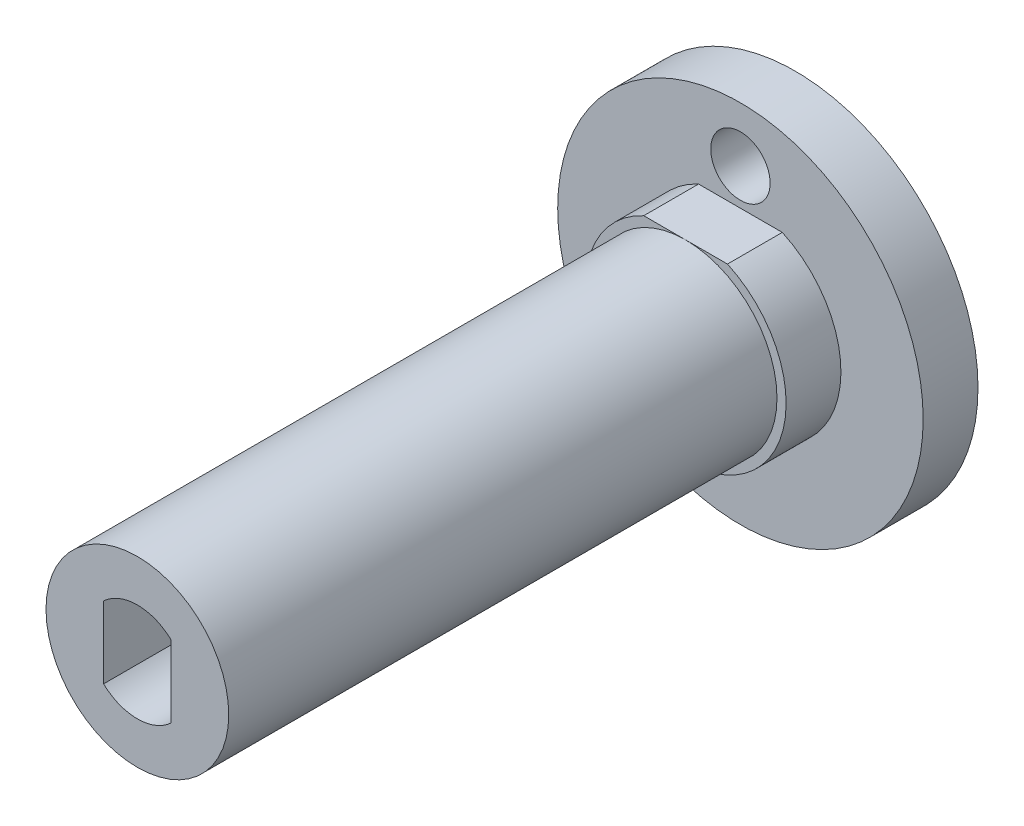
ISO-10303-21;
HEADER;
FILE_DESCRIPTION(('STEP AP214'),'2;1');
FILE_NAME('part.step','',(''),(''),'','','');
FILE_SCHEMA(('AUTOMOTIVE_DESIGN { 1 0 10303 214 1 1 1 1 }'));
ENDSEC;
DATA;
#1=APPLICATION_CONTEXT('core data for automotive mechanical design processes');
#2=APPLICATION_PROTOCOL_DEFINITION('international standard','automotive_design',2000,#1);
#3=PRODUCT_CONTEXT('',#1,'mechanical');
#4=PRODUCT('Part','Part','',(#3));
#5=PRODUCT_RELATED_PRODUCT_CATEGORY('part','',(#4));
#6=PRODUCT_DEFINITION_FORMATION('','',#4);
#7=PRODUCT_DEFINITION_CONTEXT('part definition',#1,'design');
#8=PRODUCT_DEFINITION('design','',#6,#7);
#9=PRODUCT_DEFINITION_SHAPE('','',#8);
#10=(LENGTH_UNIT() NAMED_UNIT(*) SI_UNIT(.MILLI.,.METRE.));
#11=(NAMED_UNIT(*) PLANE_ANGLE_UNIT() SI_UNIT($,.RADIAN.));
#12=(NAMED_UNIT(*) SI_UNIT($,.STERADIAN.) SOLID_ANGLE_UNIT());
#13=UNCERTAINTY_MEASURE_WITH_UNIT(LENGTH_MEASURE(1.E-05),#10,'distance_accuracy_value','');
#14=(GEOMETRIC_REPRESENTATION_CONTEXT(3) GLOBAL_UNCERTAINTY_ASSIGNED_CONTEXT((#13)) GLOBAL_UNIT_ASSIGNED_CONTEXT((#10,
#11,#12)) REPRESENTATION_CONTEXT('',''));
#15=CARTESIAN_POINT('',(0.,0.,0.));
#16=DIRECTION('',(0.,0.,1.));
#17=DIRECTION('',(1.,0.,0.));
#18=AXIS2_PLACEMENT_3D('',#15,#16,#17);
#19=CARTESIAN_POINT('',(0.,0.,3.));
#20=DIRECTION('',(0.,0.,1.));
#21=DIRECTION('',(1.,0.,0.));
#22=AXIS2_PLACEMENT_3D('',#19,#20,#21);
#23=PLANE('',#22);
#24=CARTESIAN_POINT('',(0.,0.,3.));
#25=DIRECTION('',(0.,0.,1.));
#26=DIRECTION('',(1.,0.,0.));
#27=AXIS2_PLACEMENT_3D('',#24,#25,#26);
#28=CIRCLE('',#27,5.5);
#29=CARTESIAN_POINT('',(-2.29128784747792,5.,3.));
#30=VERTEX_POINT('',#29);
#31=CARTESIAN_POINT('',(2.29128784747792,5.,3.));
#32=VERTEX_POINT('',#31);
#33=EDGE_CURVE('E135',#30,#32,#28,.T.);
#34=ORIENTED_EDGE('',*,*,#33,.F.);
#35=DIRECTION('',(-1.,0.,0.));
#36=VECTOR('',#35,1.);
#37=CARTESIAN_POINT('',(-2.29128784747792,5.,3.));
#38=LINE('',#37,#36);
#39=EDGE_CURVE('E59',#32,#30,#38,.T.);
#40=ORIENTED_EDGE('',*,*,#39,.F.);
#41=EDGE_LOOP('',(#34,#40));
#42=FACE_BOUND('',#41,.T.);
#43=CARTESIAN_POINT('',(0.,0.,3.));
#44=DIRECTION('',(0.,0.,1.));
#45=DIRECTION('',(1.,0.,0.));
#46=AXIS2_PLACEMENT_3D('',#43,#44,#45);
#47=CIRCLE('',#46,10.);
#48=CARTESIAN_POINT('',(10.,0.,3.));
#49=VERTEX_POINT('',#48);
#50=EDGE_CURVE('E11',#49,#49,#47,.T.);
#51=ORIENTED_EDGE('',*,*,#50,.T.);
#52=EDGE_LOOP('',(#51));
#53=FACE_BOUND('',#52,.T.);
#54=CARTESIAN_POINT('',(0.,7.,3.));
#55=DIRECTION('',(0.,0.,1.));
#56=DIRECTION('',(1.,0.,0.));
#57=AXIS2_PLACEMENT_3D('',#54,#55,#56);
#58=CIRCLE('',#57,1.625);
#59=CARTESIAN_POINT('',(1.625,7.,3.));
#60=VERTEX_POINT('',#59);
#61=EDGE_CURVE('E153',#60,#60,#58,.T.);
#62=ORIENTED_EDGE('',*,*,#61,.F.);
#63=EDGE_LOOP('',(#62));
#64=FACE_BOUND('',#63,.T.);
#65=ADVANCED_FACE('F37',(#42,#53,#64),#23,.T.);
#66=CARTESIAN_POINT('',(0.,0.,0.));
#67=DIRECTION('',(0.,0.,1.));
#68=DIRECTION('',(1.,0.,0.));
#69=AXIS2_PLACEMENT_3D('',#66,#67,#68);
#70=PLANE('',#69);
#71=CARTESIAN_POINT('',(0.,0.,0.));
#72=DIRECTION('',(0.,0.,1.));
#73=DIRECTION('',(1.,0.,0.));
#74=AXIS2_PLACEMENT_3D('',#71,#72,#73);
#75=CIRCLE('',#74,10.);
#76=CARTESIAN_POINT('',(10.,0.,0.));
#77=VERTEX_POINT('',#76);
#78=EDGE_CURVE('E41',#77,#77,#75,.T.);
#79=ORIENTED_EDGE('',*,*,#78,.F.);
#80=EDGE_LOOP('',(#79));
#81=FACE_BOUND('',#80,.T.);
#82=CARTESIAN_POINT('',(0.,7.,0.));
#83=DIRECTION('',(0.,0.,1.));
#84=DIRECTION('',(1.,0.,0.));
#85=AXIS2_PLACEMENT_3D('',#82,#83,#84);
#86=CIRCLE('',#85,1.625);
#87=CARTESIAN_POINT('',(1.625,7.,0.));
#88=VERTEX_POINT('',#87);
#89=EDGE_CURVE('E152',#88,#88,#86,.T.);
#90=ORIENTED_EDGE('',*,*,#89,.T.);
#91=EDGE_LOOP('',(#90));
#92=FACE_BOUND('',#91,.T.);
#93=ADVANCED_FACE('F159',(#81,#92),#70,.F.);
#94=CARTESIAN_POINT('',(0.,0.,3.));
#95=DIRECTION('',(0.,0.,-1.));
#96=DIRECTION('',(-1.,0.,0.));
#97=AXIS2_PLACEMENT_3D('',#94,#95,#96);
#98=CYLINDRICAL_SURFACE('',#97,10.);
#99=ORIENTED_EDGE('',*,*,#50,.F.);
#100=EDGE_LOOP('',(#99));
#101=FACE_BOUND('',#100,.T.);
#102=ORIENTED_EDGE('',*,*,#78,.T.);
#103=EDGE_LOOP('',(#102));
#104=FACE_BOUND('',#103,.T.);
#105=ADVANCED_FACE('F39',(#101,#104),#98,.T.);
#106=CARTESIAN_POINT('',(0.,7.,3.));
#107=DIRECTION('',(0.,0.,-1.));
#108=DIRECTION('',(-1.,0.,0.));
#109=AXIS2_PLACEMENT_3D('',#106,#107,#108);
#110=CYLINDRICAL_SURFACE('',#109,1.625);
#111=ORIENTED_EDGE('',*,*,#61,.T.);
#112=EDGE_LOOP('',(#111));
#113=FACE_BOUND('',#112,.T.);
#114=ORIENTED_EDGE('',*,*,#89,.F.);
#115=EDGE_LOOP('',(#114));
#116=FACE_BOUND('',#115,.T.);
#117=ADVANCED_FACE('F161',(#113,#116),#110,.F.);
#118=CARTESIAN_POINT('',(0.,0.,6.));
#119=DIRECTION('',(0.,0.,-1.));
#120=DIRECTION('',(-1.,0.,0.));
#121=AXIS2_PLACEMENT_3D('',#118,#119,#120);
#122=CYLINDRICAL_SURFACE('',#121,5.5);
#123=ORIENTED_EDGE('',*,*,#33,.T.);
#124=DIRECTION('',(0.,0.,-1.));
#125=VECTOR('',#124,1.);
#126=CARTESIAN_POINT('',(2.29128784747792,5.,6.));
#127=LINE('',#126,#125);
#128=CARTESIAN_POINT('',(2.29128784747792,5.,6.));
#129=VERTEX_POINT('',#128);
#130=EDGE_CURVE('E150',#129,#32,#127,.T.);
#131=ORIENTED_EDGE('',*,*,#130,.F.);
#132=CARTESIAN_POINT('',(0.,0.,6.));
#133=DIRECTION('',(0.,0.,1.));
#134=DIRECTION('',(1.,0.,0.));
#135=AXIS2_PLACEMENT_3D('',#132,#133,#134);
#136=CIRCLE('',#135,5.5);
#137=CARTESIAN_POINT('',(-2.29128784747792,5.,6.));
#138=VERTEX_POINT('',#137);
#139=EDGE_CURVE('E138',#138,#129,#136,.T.);
#140=ORIENTED_EDGE('',*,*,#139,.F.);
#141=DIRECTION('',(0.,0.,-1.));
#142=VECTOR('',#141,1.);
#143=CARTESIAN_POINT('',(-2.29128784747792,5.,6.));
#144=LINE('',#143,#142);
#145=EDGE_CURVE('E144',#138,#30,#144,.T.);
#146=ORIENTED_EDGE('',*,*,#145,.T.);
#147=EDGE_LOOP('',(#123,#131,#140,#146));
#148=FACE_BOUND('',#147,.T.);
#149=ADVANCED_FACE('F163',(#148),#122,.T.);
#150=CARTESIAN_POINT('',(-2.29128784747792,5.,6.));
#151=DIRECTION('',(0.,-1.,0.));
#152=DIRECTION('',(0.,0.,-1.));
#153=AXIS2_PLACEMENT_3D('',#150,#151,#152);
#154=PLANE('',#153);
#155=ORIENTED_EDGE('',*,*,#39,.T.);
#156=ORIENTED_EDGE('',*,*,#145,.F.);
#157=DIRECTION('',(-1.,0.,0.));
#158=VECTOR('',#157,1.);
#159=CARTESIAN_POINT('',(-2.29128784747792,5.,6.));
#160=LINE('',#159,#158);
#161=CARTESIAN_POINT('',(0.,5.,6.));
#162=VERTEX_POINT('',#161);
#163=EDGE_CURVE('E141',#162,#138,#160,.T.);
#164=ORIENTED_EDGE('',*,*,#163,.F.);
#165=EDGE_CURVE('E142',#129,#162,#160,.T.);
#166=ORIENTED_EDGE('',*,*,#165,.F.);
#167=ORIENTED_EDGE('',*,*,#130,.T.);
#168=EDGE_LOOP('',(#155,#156,#164,#166,#167));
#169=FACE_BOUND('',#168,.T.);
#170=ADVANCED_FACE('F170',(#169),#154,.F.);
#171=CARTESIAN_POINT('',(0.,0.,6.));
#172=DIRECTION('',(0.,0.,1.));
#173=DIRECTION('',(1.,0.,0.));
#174=AXIS2_PLACEMENT_3D('',#171,#172,#173);
#175=PLANE('',#174);
#176=ORIENTED_EDGE('',*,*,#165,.T.);
#177=CARTESIAN_POINT('',(0.,0.,6.));
#178=DIRECTION('',(0.,0.,1.));
#179=DIRECTION('',(1.,0.,0.));
#180=AXIS2_PLACEMENT_3D('',#177,#178,#179);
#181=CIRCLE('',#180,5.);
#182=EDGE_CURVE('E128',#162,#162,#181,.T.);
#183=ORIENTED_EDGE('',*,*,#182,.F.);
#184=ORIENTED_EDGE('',*,*,#163,.T.);
#185=ORIENTED_EDGE('',*,*,#139,.T.);
#186=EDGE_LOOP('',(#176,#183,#184,#185));
#187=FACE_BOUND('',#186,.T.);
#188=ADVANCED_FACE('F193',(#187),#175,.T.);
#189=CARTESIAN_POINT('',(0.,0.,36.));
#190=DIRECTION('',(0.,0.,-1.));
#191=DIRECTION('',(-1.,0.,0.));
#192=AXIS2_PLACEMENT_3D('',#189,#190,#191);
#193=CYLINDRICAL_SURFACE('',#192,5.);
#194=CARTESIAN_POINT('',(0.,0.,36.));
#195=DIRECTION('',(0.,0.,1.));
#196=DIRECTION('',(1.,0.,0.));
#197=AXIS2_PLACEMENT_3D('',#194,#195,#196);
#198=CIRCLE('',#197,5.);
#199=CARTESIAN_POINT('',(5.,0.,36.));
#200=VERTEX_POINT('',#199);
#201=EDGE_CURVE('E132',#200,#200,#198,.T.);
#202=ORIENTED_EDGE('',*,*,#201,.F.);
#203=EDGE_LOOP('',(#202));
#204=FACE_BOUND('',#203,.T.);
#205=ORIENTED_EDGE('',*,*,#182,.T.);
#206=EDGE_LOOP('',(#205));
#207=FACE_BOUND('',#206,.T.);
#208=ADVANCED_FACE('F196',(#204,#207),#193,.T.);
#209=CARTESIAN_POINT('',(0.,0.,36.));
#210=DIRECTION('',(0.,0.,1.));
#211=DIRECTION('',(1.,0.,0.));
#212=AXIS2_PLACEMENT_3D('',#209,#210,#211);
#213=PLANE('',#212);
#214=CARTESIAN_POINT('',(0.,0.,36.));
#215=DIRECTION('',(0.,0.,1.));
#216=DIRECTION('',(1.,0.,0.));
#217=AXIS2_PLACEMENT_3D('',#214,#215,#216);
#218=CIRCLE('',#217,2.7);
#219=CARTESIAN_POINT('',(-1.85,-1.96659604392971,36.));
#220=VERTEX_POINT('',#219);
#221=CARTESIAN_POINT('',(1.85,-1.96659604392971,36.));
#222=VERTEX_POINT('',#221);
#223=EDGE_CURVE('E52',#220,#222,#218,.T.);
#224=ORIENTED_EDGE('',*,*,#223,.F.);
#225=DIRECTION('',(0.,-1.,0.));
#226=VECTOR('',#225,1.);
#227=CARTESIAN_POINT('',(-1.85,-1.96659604392971,36.));
#228=LINE('',#227,#226);
#229=CARTESIAN_POINT('',(-1.85,1.96659604392971,36.));
#230=VERTEX_POINT('',#229);
#231=EDGE_CURVE('E113',#230,#220,#228,.T.);
#232=ORIENTED_EDGE('',*,*,#231,.F.);
#233=CARTESIAN_POINT('',(0.,0.,36.));
#234=DIRECTION('',(0.,0.,1.));
#235=DIRECTION('',(1.,0.,0.));
#236=AXIS2_PLACEMENT_3D('',#233,#234,#235);
#237=CIRCLE('',#236,2.7);
#238=CARTESIAN_POINT('',(1.85,1.96659604392971,36.));
#239=VERTEX_POINT('',#238);
#240=EDGE_CURVE('E116',#239,#230,#237,.T.);
#241=ORIENTED_EDGE('',*,*,#240,.F.);
#242=DIRECTION('',(0.,1.,0.));
#243=VECTOR('',#242,1.);
#244=CARTESIAN_POINT('',(1.85,-1.96659604392971,36.));
#245=LINE('',#244,#243);
#246=EDGE_CURVE('E122',#222,#239,#245,.T.);
#247=ORIENTED_EDGE('',*,*,#246,.F.);
#248=EDGE_LOOP('',(#224,#232,#241,#247));
#249=FACE_BOUND('',#248,.T.);
#250=ORIENTED_EDGE('',*,*,#201,.T.);
#251=EDGE_LOOP('',(#250));
#252=FACE_BOUND('',#251,.T.);
#253=ADVANCED_FACE('F198',(#249,#252),#213,.T.);
#254=CARTESIAN_POINT('',(0.,0.,28.));
#255=DIRECTION('',(0.,0.,1.));
#256=DIRECTION('',(1.,0.,0.));
#257=AXIS2_PLACEMENT_3D('',#254,#255,#256);
#258=CYLINDRICAL_SURFACE('',#257,2.7);
#259=ORIENTED_EDGE('',*,*,#223,.T.);
#260=DIRECTION('',(0.,0.,1.));
#261=VECTOR('',#260,1.);
#262=CARTESIAN_POINT('',(1.85,-1.96659604392971,28.));
#263=LINE('',#262,#261);
#264=CARTESIAN_POINT('',(1.85,-1.96659604392971,28.));
#265=VERTEX_POINT('',#264);
#266=EDGE_CURVE('E91',#265,#222,#263,.T.);
#267=ORIENTED_EDGE('',*,*,#266,.F.);
#268=CARTESIAN_POINT('',(0.,0.,28.));
#269=DIRECTION('',(0.,0.,1.));
#270=DIRECTION('',(1.,0.,0.));
#271=AXIS2_PLACEMENT_3D('',#268,#269,#270);
#272=CIRCLE('',#271,2.7);
#273=CARTESIAN_POINT('',(-1.85,-1.96659604392971,28.));
#274=VERTEX_POINT('',#273);
#275=EDGE_CURVE('E95',#274,#265,#272,.T.);
#276=ORIENTED_EDGE('',*,*,#275,.F.);
#277=DIRECTION('',(0.,0.,1.));
#278=VECTOR('',#277,1.);
#279=CARTESIAN_POINT('',(-1.85,-1.96659604392971,28.));
#280=LINE('',#279,#278);
#281=EDGE_CURVE('E126',#274,#220,#280,.T.);
#282=ORIENTED_EDGE('',*,*,#281,.T.);
#283=EDGE_LOOP('',(#259,#267,#276,#282));
#284=FACE_BOUND('',#283,.T.);
#285=ADVANCED_FACE('F93',(#284),#258,.F.);
#286=CARTESIAN_POINT('',(-1.85,-1.96659604392971,28.));
#287=DIRECTION('',(-1.,0.,0.));
#288=DIRECTION('',(0.,0.,1.));
#289=AXIS2_PLACEMENT_3D('',#286,#287,#288);
#290=PLANE('',#289);
#291=ORIENTED_EDGE('',*,*,#231,.T.);
#292=ORIENTED_EDGE('',*,*,#281,.F.);
#293=DIRECTION('',(0.,-1.,0.));
#294=VECTOR('',#293,1.);
#295=CARTESIAN_POINT('',(-1.85,-1.96659604392971,28.));
#296=LINE('',#295,#294);
#297=CARTESIAN_POINT('',(-1.85,1.96659604392971,28.));
#298=VERTEX_POINT('',#297);
#299=EDGE_CURVE('E101',#298,#274,#296,.T.);
#300=ORIENTED_EDGE('',*,*,#299,.F.);
#301=DIRECTION('',(0.,0.,1.));
#302=VECTOR('',#301,1.);
#303=CARTESIAN_POINT('',(-1.85,1.96659604392971,28.));
#304=LINE('',#303,#302);
#305=EDGE_CURVE('E129',#298,#230,#304,.T.);
#306=ORIENTED_EDGE('',*,*,#305,.T.);
#307=EDGE_LOOP('',(#291,#292,#300,#306));
#308=FACE_BOUND('',#307,.T.);
#309=ADVANCED_FACE('F242',(#308),#290,.F.);
#310=CARTESIAN_POINT('',(0.,0.,28.));
#311=DIRECTION('',(0.,0.,1.));
#312=DIRECTION('',(1.,0.,0.));
#313=AXIS2_PLACEMENT_3D('',#310,#311,#312);
#314=CYLINDRICAL_SURFACE('',#313,2.7);
#315=ORIENTED_EDGE('',*,*,#240,.T.);
#316=ORIENTED_EDGE('',*,*,#305,.F.);
#317=CARTESIAN_POINT('',(0.,0.,28.));
#318=DIRECTION('',(0.,0.,1.));
#319=DIRECTION('',(1.,0.,0.));
#320=AXIS2_PLACEMENT_3D('',#317,#318,#319);
#321=CIRCLE('',#320,2.7);
#322=CARTESIAN_POINT('',(1.85,1.96659604392971,28.));
#323=VERTEX_POINT('',#322);
#324=EDGE_CURVE('E109',#323,#298,#321,.T.);
#325=ORIENTED_EDGE('',*,*,#324,.F.);
#326=DIRECTION('',(0.,0.,1.));
#327=VECTOR('',#326,1.);
#328=CARTESIAN_POINT('',(1.85,1.96659604392971,28.));
#329=LINE('',#328,#327);
#330=EDGE_CURVE('E100',#323,#239,#329,.T.);
#331=ORIENTED_EDGE('',*,*,#330,.T.);
#332=EDGE_LOOP('',(#315,#316,#325,#331));
#333=FACE_BOUND('',#332,.T.);
#334=ADVANCED_FACE('F251',(#333),#314,.F.);
#335=CARTESIAN_POINT('',(1.85,-1.96659604392971,28.));
#336=DIRECTION('',(1.,0.,0.));
#337=DIRECTION('',(0.,0.,-1.));
#338=AXIS2_PLACEMENT_3D('',#335,#336,#337);
#339=PLANE('',#338);
#340=ORIENTED_EDGE('',*,*,#246,.T.);
#341=ORIENTED_EDGE('',*,*,#330,.F.);
#342=DIRECTION('',(0.,1.,0.));
#343=VECTOR('',#342,1.);
#344=CARTESIAN_POINT('',(1.85,-1.96659604392971,28.));
#345=LINE('',#344,#343);
#346=EDGE_CURVE('E104',#265,#323,#345,.T.);
#347=ORIENTED_EDGE('',*,*,#346,.F.);
#348=ORIENTED_EDGE('',*,*,#266,.T.);
#349=EDGE_LOOP('',(#340,#341,#347,#348));
#350=FACE_BOUND('',#349,.T.);
#351=ADVANCED_FACE('F105',(#350),#339,.F.);
#352=CARTESIAN_POINT('',(0.,0.,28.));
#353=DIRECTION('',(0.,0.,1.));
#354=DIRECTION('',(1.,0.,0.));
#355=AXIS2_PLACEMENT_3D('',#352,#353,#354);
#356=PLANE('',#355);
#357=ORIENTED_EDGE('',*,*,#275,.T.);
#358=ORIENTED_EDGE('',*,*,#346,.T.);
#359=ORIENTED_EDGE('',*,*,#324,.T.);
#360=ORIENTED_EDGE('',*,*,#299,.T.);
#361=EDGE_LOOP('',(#357,#358,#359,#360));
#362=FACE_BOUND('',#361,.T.);
#363=ADVANCED_FACE('F111',(#362),#356,.T.);
#364=CLOSED_SHELL('',(#65,#93,#105,#117,#149,#170,#188,#208,#253,#285,#309,#334,#351,#363));
#365=MANIFOLD_SOLID_BREP('B2',#364);
#366=ADVANCED_BREP_SHAPE_REPRESENTATION('',(#18,#365),#14);
#367=SHAPE_DEFINITION_REPRESENTATION(#9,#366);
ENDSEC;
END-ISO-10303-21;
